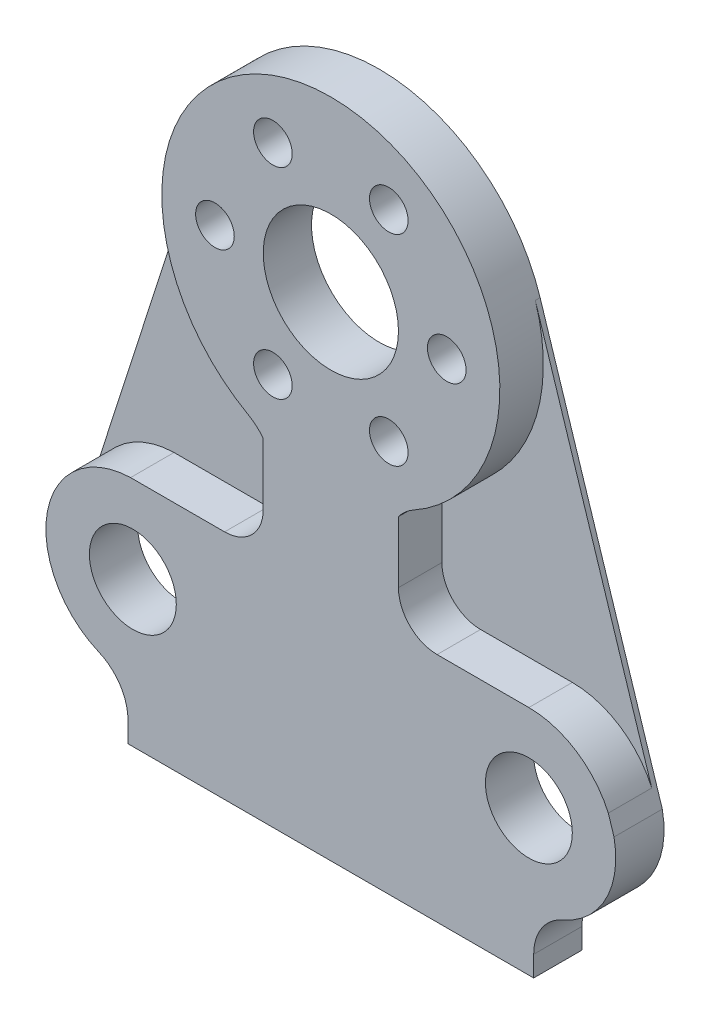
ISO-10303-21;
HEADER;
FILE_DESCRIPTION(('STEP AP214'),'2;1');
FILE_NAME('part.step','',(''),(''),'','','');
FILE_SCHEMA(('AUTOMOTIVE_DESIGN { 1 0 10303 214 1 1 1 1 }'));
ENDSEC;
DATA;
#1=APPLICATION_CONTEXT('core data for automotive mechanical design processes');
#2=APPLICATION_PROTOCOL_DEFINITION('international standard','automotive_design',2000,#1);
#3=PRODUCT_CONTEXT('',#1,'mechanical');
#4=PRODUCT('Part','Part','',(#3));
#5=PRODUCT_RELATED_PRODUCT_CATEGORY('part','',(#4));
#6=PRODUCT_DEFINITION_FORMATION('','',#4);
#7=PRODUCT_DEFINITION_CONTEXT('part definition',#1,'design');
#8=PRODUCT_DEFINITION('design','',#6,#7);
#9=PRODUCT_DEFINITION_SHAPE('','',#8);
#10=(LENGTH_UNIT() NAMED_UNIT(*) SI_UNIT(.MILLI.,.METRE.));
#11=(NAMED_UNIT(*) PLANE_ANGLE_UNIT() SI_UNIT($,.RADIAN.));
#12=(NAMED_UNIT(*) SI_UNIT($,.STERADIAN.) SOLID_ANGLE_UNIT());
#13=UNCERTAINTY_MEASURE_WITH_UNIT(LENGTH_MEASURE(1.E-05),#10,'distance_accuracy_value','');
#14=(GEOMETRIC_REPRESENTATION_CONTEXT(3) GLOBAL_UNCERTAINTY_ASSIGNED_CONTEXT((#13)) GLOBAL_UNIT_ASSIGNED_CONTEXT((#10,
#11,#12)) REPRESENTATION_CONTEXT('',''));
#15=CARTESIAN_POINT('',(0.,0.,0.));
#16=DIRECTION('',(0.,0.,1.));
#17=DIRECTION('',(1.,0.,0.));
#18=AXIS2_PLACEMENT_3D('',#15,#16,#17);
#19=CARTESIAN_POINT('',(0.,0.,10.));
#20=DIRECTION('',(0.,0.,-1.));
#21=DIRECTION('',(-1.,0.,0.));
#22=AXIS2_PLACEMENT_3D('',#19,#20,#21);
#23=CYLINDRICAL_SURFACE('',#22,35.);
#24=DIRECTION('',(0.,0.,-1.));
#25=VECTOR('',#24,1.);
#26=CARTESIAN_POINT('',(-33.3347186790443,10.667545668474,1.));
#27=LINE('',#26,#25);
#28=CARTESIAN_POINT('',(-33.3347186790443,10.667545668474,0.999999999999999));
#29=VERTEX_POINT('',#28);
#30=CARTESIAN_POINT('',(-33.3347186790431,10.6675456684777,0.));
#31=VERTEX_POINT('',#30);
#32=EDGE_CURVE('E50',#29,#31,#27,.T.);
#33=ORIENTED_EDGE('',*,*,#32,.F.);
#34=CARTESIAN_POINT('',(0.,0.,1.));
#35=DIRECTION('',(0.,0.,1.));
#36=DIRECTION('',(1.,0.,0.));
#37=AXIS2_PLACEMENT_3D('',#34,#35,#36);
#38=CIRCLE('',#37,35.);
#39=CARTESIAN_POINT('',(-17.1111111111111,-30.5321122188297,0.999999999999999));
#40=VERTEX_POINT('',#39);
#41=EDGE_CURVE('E55',#29,#40,#38,.T.);
#42=ORIENTED_EDGE('',*,*,#41,.T.);
#43=DIRECTION('',(0.,0.,-1.));
#44=VECTOR('',#43,1.);
#45=CARTESIAN_POINT('',(-17.1111111111111,-30.5321122188297,10.));
#46=LINE('',#45,#44);
#47=CARTESIAN_POINT('',(-17.1111111111111,-30.5321122188297,10.));
#48=VERTEX_POINT('',#47);
#49=EDGE_CURVE('E11',#48,#40,#46,.T.);
#50=ORIENTED_EDGE('',*,*,#49,.F.);
#51=CARTESIAN_POINT('',(0.,0.,10.));
#52=DIRECTION('',(0.,0.,1.));
#53=DIRECTION('',(1.,0.,0.));
#54=AXIS2_PLACEMENT_3D('',#51,#52,#53);
#55=CIRCLE('',#54,35.);
#56=CARTESIAN_POINT('',(17.1111111111111,-30.5321122188297,10.));
#57=VERTEX_POINT('',#56);
#58=EDGE_CURVE('E177',#57,#48,#55,.T.);
#59=ORIENTED_EDGE('',*,*,#58,.F.);
#60=DIRECTION('',(0.,0.,-1.));
#61=VECTOR('',#60,1.);
#62=CARTESIAN_POINT('',(17.1111111111111,-30.5321122188297,10.));
#63=LINE('',#62,#61);
#64=CARTESIAN_POINT('',(17.1111111111111,-30.5321122188297,0.999999999999999));
#65=VERTEX_POINT('',#64);
#66=EDGE_CURVE('E241',#57,#65,#63,.T.);
#67=ORIENTED_EDGE('',*,*,#66,.T.);
#68=CARTESIAN_POINT('',(0.,0.,1.));
#69=DIRECTION('',(0.,0.,1.));
#70=DIRECTION('',(1.,0.,0.));
#71=AXIS2_PLACEMENT_3D('',#68,#69,#70);
#72=CIRCLE('',#71,35.);
#73=CARTESIAN_POINT('',(33.3347186790443,10.6675456684739,0.999999999999999));
#74=VERTEX_POINT('',#73);
#75=EDGE_CURVE('E377',#65,#74,#72,.T.);
#76=ORIENTED_EDGE('',*,*,#75,.T.);
#77=DIRECTION('',(0.,0.,-1.));
#78=VECTOR('',#77,1.);
#79=CARTESIAN_POINT('',(33.3347186790443,10.667545668474,1.));
#80=LINE('',#79,#78);
#81=CARTESIAN_POINT('',(33.3347186790443,10.667545668474,0.));
#82=VERTEX_POINT('',#81);
#83=EDGE_CURVE('E246',#74,#82,#80,.T.);
#84=ORIENTED_EDGE('',*,*,#83,.T.);
#85=CARTESIAN_POINT('',(0.,0.,0.));
#86=DIRECTION('',(0.,0.,1.));
#87=DIRECTION('',(1.,0.,0.));
#88=AXIS2_PLACEMENT_3D('',#85,#86,#87);
#89=CIRCLE('',#88,35.);
#90=EDGE_CURVE('E264',#82,#31,#89,.T.);
#91=ORIENTED_EDGE('',*,*,#90,.T.);
#92=EDGE_LOOP('',(#33,#42,#50,#59,#67,#76,#84,#91));
#93=FACE_BOUND('',#92,.T.);
#94=ADVANCED_FACE('F35',(#93),#23,.T.);
#95=CARTESIAN_POINT('',(-22.,-39.2555728527811,10.));
#96=DIRECTION('',(0.,0.,-1.));
#97=DIRECTION('',(-1.,0.,0.));
#98=AXIS2_PLACEMENT_3D('',#95,#96,#97);
#99=CYLINDRICAL_SURFACE('',#98,10.);
#100=CARTESIAN_POINT('',(-22.,-39.2555728527811,1.));
#101=DIRECTION('',(0.,0.,1.));
#102=DIRECTION('',(1.,0.,0.));
#103=AXIS2_PLACEMENT_3D('',#100,#101,#102);
#104=CIRCLE('',#103,10.);
#105=CARTESIAN_POINT('',(-14.,-33.255572852781,0.999999999999999));
#106=VERTEX_POINT('',#105);
#107=EDGE_CURVE('E342',#106,#40,#104,.T.);
#108=ORIENTED_EDGE('',*,*,#107,.F.);
#109=DIRECTION('',(0.,0.,-1.));
#110=VECTOR('',#109,1.);
#111=CARTESIAN_POINT('',(-14.,-33.255572852781,10.));
#112=LINE('',#111,#110);
#113=CARTESIAN_POINT('',(-14.,-33.255572852781,10.));
#114=VERTEX_POINT('',#113);
#115=EDGE_CURVE('E43',#114,#106,#112,.T.);
#116=ORIENTED_EDGE('',*,*,#115,.F.);
#117=CARTESIAN_POINT('',(-22.,-39.2555728527811,10.));
#118=DIRECTION('',(0.,0.,1.));
#119=DIRECTION('',(1.,0.,0.));
#120=AXIS2_PLACEMENT_3D('',#117,#118,#119);
#121=CIRCLE('',#120,10.);
#122=EDGE_CURVE('E181',#114,#48,#121,.T.);
#123=ORIENTED_EDGE('',*,*,#122,.T.);
#124=ORIENTED_EDGE('',*,*,#49,.T.);
#125=EDGE_LOOP('',(#108,#116,#123,#124));
#126=FACE_BOUND('',#125,.T.);
#127=ADVANCED_FACE('F191',(#126),#99,.F.);
#128=CARTESIAN_POINT('',(-14.,0.,10.));
#129=DIRECTION('',(1.,0.,0.));
#130=DIRECTION('',(0.,1.,0.));
#131=AXIS2_PLACEMENT_3D('',#128,#129,#130);
#132=PLANE('',#131);
#133=ORIENTED_EDGE('',*,*,#115,.T.);
#134=DIRECTION('',(0.,-1.,0.));
#135=VECTOR('',#134,1.);
#136=CARTESIAN_POINT('',(-14.,0.,1.));
#137=LINE('',#136,#135);
#138=CARTESIAN_POINT('',(-14.,-46.,0.999999999999999));
#139=VERTEX_POINT('',#138);
#140=EDGE_CURVE('E338',#106,#139,#137,.T.);
#141=ORIENTED_EDGE('',*,*,#140,.T.);
#142=DIRECTION('',(0.,0.,-1.));
#143=VECTOR('',#142,1.);
#144=CARTESIAN_POINT('',(-14.,-46.,10.));
#145=LINE('',#144,#143);
#146=CARTESIAN_POINT('',(-14.,-46.,10.));
#147=VERTEX_POINT('',#146);
#148=EDGE_CURVE('E332',#147,#139,#145,.T.);
#149=ORIENTED_EDGE('',*,*,#148,.F.);
#150=DIRECTION('',(0.,-1.,0.));
#151=VECTOR('',#150,1.);
#152=CARTESIAN_POINT('',(-14.,0.,10.));
#153=LINE('',#152,#151);
#154=EDGE_CURVE('E194',#114,#147,#153,.T.);
#155=ORIENTED_EDGE('',*,*,#154,.F.);
#156=EDGE_LOOP('',(#133,#141,#149,#155));
#157=FACE_BOUND('',#156,.T.);
#158=ADVANCED_FACE('F336',(#157),#132,.F.);
#159=CARTESIAN_POINT('',(-22.,-46.,10.));
#160=DIRECTION('',(0.,0.,-1.));
#161=DIRECTION('',(-1.,0.,0.));
#162=AXIS2_PLACEMENT_3D('',#159,#160,#161);
#163=CYLINDRICAL_SURFACE('',#162,7.9999999999991);
#164=ORIENTED_EDGE('',*,*,#148,.T.);
#165=CARTESIAN_POINT('',(-22.,-46.,1.));
#166=DIRECTION('',(0.,0.,1.));
#167=DIRECTION('',(1.,0.,0.));
#168=AXIS2_PLACEMENT_3D('',#165,#166,#167);
#169=CIRCLE('',#168,7.9999999999991);
#170=CARTESIAN_POINT('',(-21.9999999999984,-53.9999999999982,0.999999999999999));
#171=VERTEX_POINT('',#170);
#172=EDGE_CURVE('E344',#139,#171,#169,.F.);
#173=ORIENTED_EDGE('',*,*,#172,.T.);
#174=DIRECTION('',(0.,0.,-1.));
#175=VECTOR('',#174,1.);
#176=CARTESIAN_POINT('',(-21.9999999999984,-53.9999999999982,10.));
#177=LINE('',#176,#175);
#178=CARTESIAN_POINT('',(-21.9999999999984,-53.9999999999982,10.));
#179=VERTEX_POINT('',#178);
#180=EDGE_CURVE('E329',#179,#171,#177,.T.);
#181=ORIENTED_EDGE('',*,*,#180,.F.);
#182=CARTESIAN_POINT('',(-22.,-46.,10.));
#183=DIRECTION('',(0.,0.,1.));
#184=DIRECTION('',(1.,0.,0.));
#185=AXIS2_PLACEMENT_3D('',#182,#183,#184);
#186=CIRCLE('',#185,7.9999999999991);
#187=EDGE_CURVE('E196',#147,#179,#186,.F.);
#188=ORIENTED_EDGE('',*,*,#187,.F.);
#189=EDGE_LOOP('',(#164,#173,#181,#188));
#190=FACE_BOUND('',#189,.T.);
#191=ADVANCED_FACE('F533',(#190),#163,.F.);
#192=CARTESIAN_POINT('',(-1.57815031569447E-12,-53.9999999999988,10.));
#193=DIRECTION('',(0.,1.,0.));
#194=DIRECTION('',(-1.,0.,0.));
#195=AXIS2_PLACEMENT_3D('',#192,#193,#194);
#196=PLANE('',#195);
#197=DIRECTION('',(1.,0.,0.));
#198=VECTOR('',#197,1.);
#199=CARTESIAN_POINT('',(-1.57815031569447E-12,-53.9999999999988,1.));
#200=LINE('',#199,#198);
#201=CARTESIAN_POINT('',(-41.4692621488196,-53.9999999999976,0.999999999999999));
#202=VERTEX_POINT('',#201);
#203=EDGE_CURVE('E357',#202,#171,#200,.T.);
#204=ORIENTED_EDGE('',*,*,#203,.F.);
#205=DIRECTION('',(0.,0.,-1.));
#206=VECTOR('',#205,1.);
#207=CARTESIAN_POINT('',(-41.4692621488196,-53.9999999999976,10.));
#208=LINE('',#207,#206);
#209=CARTESIAN_POINT('',(-41.4692621488196,-53.9999999999976,10.));
#210=VERTEX_POINT('',#209);
#211=EDGE_CURVE('E326',#210,#202,#208,.T.);
#212=ORIENTED_EDGE('',*,*,#211,.F.);
#213=DIRECTION('',(1.,0.,0.));
#214=VECTOR('',#213,1.);
#215=CARTESIAN_POINT('',(-1.57815031569447E-12,-53.9999999999988,10.));
#216=LINE('',#215,#214);
#217=EDGE_CURVE('E201',#210,#179,#216,.T.);
#218=ORIENTED_EDGE('',*,*,#217,.T.);
#219=ORIENTED_EDGE('',*,*,#180,.T.);
#220=EDGE_LOOP('',(#204,#212,#218,#219));
#221=FACE_BOUND('',#220,.T.);
#222=ADVANCED_FACE('F529',(#221),#196,.T.);
#223=CARTESIAN_POINT('',(-41.,-72.,10.));
#224=DIRECTION('',(0.,0.,-1.));
#225=DIRECTION('',(-1.,0.,0.));
#226=AXIS2_PLACEMENT_3D('',#223,#224,#225);
#227=CYLINDRICAL_SURFACE('',#226,18.0061158211426);
#228=CARTESIAN_POINT('',(-41.,-72.,1.));
#229=DIRECTION('',(0.,0.,1.));
#230=DIRECTION('',(1.,0.,0.));
#231=AXIS2_PLACEMENT_3D('',#228,#229,#230);
#232=CIRCLE('',#231,18.0061158211426);
#233=CARTESIAN_POINT('',(-58.141884057955,-66.4885557330198,0.999999999999999));
#234=VERTEX_POINT('',#233);
#235=EDGE_CURVE('E355',#202,#234,#232,.T.);
#236=ORIENTED_EDGE('',*,*,#235,.T.);
#237=DIRECTION('',(0.,0.,-1.));
#238=VECTOR('',#237,1.);
#239=CARTESIAN_POINT('',(-58.141884057955,-66.4885557330198,1.));
#240=LINE('',#239,#238);
#241=CARTESIAN_POINT('',(-58.141884057955,-66.4885557330198,0.));
#242=VERTEX_POINT('',#241);
#243=EDGE_CURVE('E359',#234,#242,#240,.T.);
#244=ORIENTED_EDGE('',*,*,#243,.T.);
#245=CARTESIAN_POINT('',(-41.,-72.,0.));
#246=DIRECTION('',(0.,0.,1.));
#247=DIRECTION('',(1.,0.,0.));
#248=AXIS2_PLACEMENT_3D('',#245,#246,#247);
#249=CIRCLE('',#248,18.0061158211426);
#250=CARTESIAN_POINT('',(-48.0722864711944,-88.5590751865484,0.));
#251=VERTEX_POINT('',#250);
#252=EDGE_CURVE('E266',#242,#251,#249,.T.);
#253=ORIENTED_EDGE('',*,*,#252,.T.);
#254=DIRECTION('',(0.,0.,-1.));
#255=VECTOR('',#254,1.);
#256=CARTESIAN_POINT('',(-48.0722864711944,-88.5590751865484,10.));
#257=LINE('',#256,#255);
#258=CARTESIAN_POINT('',(-48.0722864711944,-88.5590751865484,10.));
#259=VERTEX_POINT('',#258);
#260=EDGE_CURVE('E323',#259,#251,#257,.T.);
#261=ORIENTED_EDGE('',*,*,#260,.F.);
#262=CARTESIAN_POINT('',(-41.,-72.,10.));
#263=DIRECTION('',(0.,0.,1.));
#264=DIRECTION('',(1.,0.,0.));
#265=AXIS2_PLACEMENT_3D('',#262,#263,#264);
#266=CIRCLE('',#265,18.0061158211426);
#267=EDGE_CURVE('E204',#210,#259,#266,.T.);
#268=ORIENTED_EDGE('',*,*,#267,.F.);
#269=ORIENTED_EDGE('',*,*,#211,.T.);
#270=EDGE_LOOP('',(#236,#244,#253,#261,#268,#269));
#271=FACE_BOUND('',#270,.T.);
#272=ADVANCED_FACE('F525',(#271),#227,.T.);
#273=CARTESIAN_POINT('',(-52.,-97.7554367733711,10.));
#274=DIRECTION('',(0.,0.,-1.));
#275=DIRECTION('',(-1.,0.,0.));
#276=AXIS2_PLACEMENT_3D('',#273,#274,#275);
#277=CYLINDRICAL_SURFACE('',#276,9.9999999999988);
#278=CARTESIAN_POINT('',(-52.,-97.7554367733711,0.));
#279=DIRECTION('',(0.,0.,1.));
#280=DIRECTION('',(1.,0.,0.));
#281=AXIS2_PLACEMENT_3D('',#278,#279,#280);
#282=CIRCLE('',#281,9.9999999999988);
#283=CARTESIAN_POINT('',(-42.,-97.7554367733737,0.));
#284=VERTEX_POINT('',#283);
#285=EDGE_CURVE('E268',#284,#251,#282,.T.);
#286=ORIENTED_EDGE('',*,*,#285,.F.);
#287=DIRECTION('',(0.,0.,-1.));
#288=VECTOR('',#287,1.);
#289=CARTESIAN_POINT('',(-42.,-97.7554367733737,10.));
#290=LINE('',#289,#288);
#291=CARTESIAN_POINT('',(-42.,-97.7554367733737,10.));
#292=VERTEX_POINT('',#291);
#293=EDGE_CURVE('E321',#292,#284,#290,.T.);
#294=ORIENTED_EDGE('',*,*,#293,.F.);
#295=CARTESIAN_POINT('',(-52.,-97.7554367733711,10.));
#296=DIRECTION('',(0.,0.,1.));
#297=DIRECTION('',(1.,0.,0.));
#298=AXIS2_PLACEMENT_3D('',#295,#296,#297);
#299=CIRCLE('',#298,9.9999999999988);
#300=EDGE_CURVE('E206',#292,#259,#299,.T.);
#301=ORIENTED_EDGE('',*,*,#300,.T.);
#302=ORIENTED_EDGE('',*,*,#260,.T.);
#303=EDGE_LOOP('',(#286,#294,#301,#302));
#304=FACE_BOUND('',#303,.T.);
#305=ADVANCED_FACE('F521',(#304),#277,.F.);
#306=CARTESIAN_POINT('',(-41.9999999999998,0.,10.));
#307=DIRECTION('',(1.,0.,0.));
#308=DIRECTION('',(0.,1.,0.));
#309=AXIS2_PLACEMENT_3D('',#306,#307,#308);
#310=PLANE('',#309);
#311=DIRECTION('',(0.,-1.,0.));
#312=VECTOR('',#311,1.);
#313=CARTESIAN_POINT('',(-41.9999999999998,0.,0.));
#314=LINE('',#313,#312);
#315=CARTESIAN_POINT('',(-42.,-102.,0.));
#316=VERTEX_POINT('',#315);
#317=EDGE_CURVE('E271',#284,#316,#314,.T.);
#318=ORIENTED_EDGE('',*,*,#317,.T.);
#319=DIRECTION('',(0.,0.,-1.));
#320=VECTOR('',#319,1.);
#321=CARTESIAN_POINT('',(-42.,-102.,10.));
#322=LINE('',#321,#320);
#323=CARTESIAN_POINT('',(-42.,-102.,10.));
#324=VERTEX_POINT('',#323);
#325=EDGE_CURVE('E318',#324,#316,#322,.T.);
#326=ORIENTED_EDGE('',*,*,#325,.F.);
#327=DIRECTION('',(0.,-1.,0.));
#328=VECTOR('',#327,1.);
#329=CARTESIAN_POINT('',(-41.9999999999998,0.,10.));
#330=LINE('',#329,#328);
#331=EDGE_CURVE('E209',#292,#324,#330,.T.);
#332=ORIENTED_EDGE('',*,*,#331,.F.);
#333=ORIENTED_EDGE('',*,*,#293,.T.);
#334=EDGE_LOOP('',(#318,#326,#332,#333));
#335=FACE_BOUND('',#334,.T.);
#336=ADVANCED_FACE('F517',(#335),#310,.F.);
#337=CARTESIAN_POINT('',(0.,-102.,10.));
#338=DIRECTION('',(0.,1.,0.));
#339=DIRECTION('',(0.,0.,1.));
#340=AXIS2_PLACEMENT_3D('',#337,#338,#339);
#341=PLANE('',#340);
#342=DIRECTION('',(1.,0.,0.));
#343=VECTOR('',#342,1.);
#344=CARTESIAN_POINT('',(0.,-102.,0.));
#345=LINE('',#344,#343);
#346=CARTESIAN_POINT('',(42.,-102.,0.));
#347=VERTEX_POINT('',#346);
#348=EDGE_CURVE('E273',#316,#347,#345,.T.);
#349=ORIENTED_EDGE('',*,*,#348,.T.);
#350=DIRECTION('',(0.,0.,-1.));
#351=VECTOR('',#350,1.);
#352=CARTESIAN_POINT('',(42.,-102.,10.));
#353=LINE('',#352,#351);
#354=CARTESIAN_POINT('',(42.,-102.,10.));
#355=VERTEX_POINT('',#354);
#356=EDGE_CURVE('E316',#355,#347,#353,.T.);
#357=ORIENTED_EDGE('',*,*,#356,.F.);
#358=DIRECTION('',(1.,0.,0.));
#359=VECTOR('',#358,1.);
#360=CARTESIAN_POINT('',(0.,-102.,10.));
#361=LINE('',#360,#359);
#362=EDGE_CURVE('E211',#324,#355,#361,.T.);
#363=ORIENTED_EDGE('',*,*,#362,.F.);
#364=ORIENTED_EDGE('',*,*,#325,.T.);
#365=EDGE_LOOP('',(#349,#357,#363,#364));
#366=FACE_BOUND('',#365,.T.);
#367=ADVANCED_FACE('F513',(#366),#341,.F.);
#368=CARTESIAN_POINT('',(42.,0.,10.));
#369=DIRECTION('',(1.,0.,0.));
#370=DIRECTION('',(0.,0.,-1.));
#371=AXIS2_PLACEMENT_3D('',#368,#369,#370);
#372=PLANE('',#371);
#373=DIRECTION('',(0.,-1.,0.));
#374=VECTOR('',#373,1.);
#375=CARTESIAN_POINT('',(42.,0.,0.));
#376=LINE('',#375,#374);
#377=CARTESIAN_POINT('',(42.,-97.7487863791674,0.));
#378=VERTEX_POINT('',#377);
#379=EDGE_CURVE('E276',#378,#347,#376,.T.);
#380=ORIENTED_EDGE('',*,*,#379,.F.);
#381=DIRECTION('',(0.,0.,-1.));
#382=VECTOR('',#381,1.);
#383=CARTESIAN_POINT('',(42.,-97.7487863791674,10.));
#384=LINE('',#383,#382);
#385=CARTESIAN_POINT('',(42.,-97.7487863791674,10.));
#386=VERTEX_POINT('',#385);
#387=EDGE_CURVE('E314',#386,#378,#384,.T.);
#388=ORIENTED_EDGE('',*,*,#387,.F.);
#389=DIRECTION('',(0.,-1.,0.));
#390=VECTOR('',#389,1.);
#391=CARTESIAN_POINT('',(42.,0.,10.));
#392=LINE('',#391,#390);
#393=EDGE_CURVE('E213',#386,#355,#392,.T.);
#394=ORIENTED_EDGE('',*,*,#393,.T.);
#395=ORIENTED_EDGE('',*,*,#356,.T.);
#396=EDGE_LOOP('',(#380,#388,#394,#395));
#397=FACE_BOUND('',#396,.T.);
#398=ADVANCED_FACE('F509',(#397),#372,.T.);
#399=CARTESIAN_POINT('',(52.,-97.7487863791675,10.));
#400=DIRECTION('',(0.,0.,-1.));
#401=DIRECTION('',(-1.,0.,0.));
#402=AXIS2_PLACEMENT_3D('',#399,#400,#401);
#403=CYLINDRICAL_SURFACE('',#402,10.);
#404=CARTESIAN_POINT('',(52.,-97.7487863791675,0.));
#405=DIRECTION('',(0.,0.,1.));
#406=DIRECTION('',(1.,0.,0.));
#407=AXIS2_PLACEMENT_3D('',#404,#405,#406);
#408=CIRCLE('',#407,10.);
#409=CARTESIAN_POINT('',(48.0714285714286,-88.5527912437505,0.));
#410=VERTEX_POINT('',#409);
#411=EDGE_CURVE('E279',#410,#378,#408,.T.);
#412=ORIENTED_EDGE('',*,*,#411,.F.);
#413=DIRECTION('',(0.,0.,-1.));
#414=VECTOR('',#413,1.);
#415=CARTESIAN_POINT('',(48.0714285714286,-88.5527912437505,10.));
#416=LINE('',#415,#414);
#417=CARTESIAN_POINT('',(48.0714285714286,-88.5527912437505,10.));
#418=VERTEX_POINT('',#417);
#419=EDGE_CURVE('E312',#418,#410,#416,.T.);
#420=ORIENTED_EDGE('',*,*,#419,.F.);
#421=CARTESIAN_POINT('',(52.,-97.7487863791675,10.));
#422=DIRECTION('',(0.,0.,1.));
#423=DIRECTION('',(1.,0.,0.));
#424=AXIS2_PLACEMENT_3D('',#421,#422,#423);
#425=CIRCLE('',#424,10.);
#426=EDGE_CURVE('E216',#418,#386,#425,.T.);
#427=ORIENTED_EDGE('',*,*,#426,.T.);
#428=ORIENTED_EDGE('',*,*,#387,.T.);
#429=EDGE_LOOP('',(#412,#420,#427,#428));
#430=FACE_BOUND('',#429,.T.);
#431=ADVANCED_FACE('F506',(#430),#403,.F.);
#432=CARTESIAN_POINT('',(41.,-72.,10.));
#433=DIRECTION('',(0.,0.,-1.));
#434=DIRECTION('',(-1.,0.,0.));
#435=AXIS2_PLACEMENT_3D('',#432,#433,#434);
#436=CYLINDRICAL_SURFACE('',#435,18.);
#437=CARTESIAN_POINT('',(41.,-72.,0.));
#438=DIRECTION('',(0.,0.,1.));
#439=DIRECTION('',(1.,0.,0.));
#440=AXIS2_PLACEMENT_3D('',#437,#438,#439);
#441=CIRCLE('',#440,18.);
#442=CARTESIAN_POINT('',(58.6344867006033,-68.3910003039286,0.));
#443=VERTEX_POINT('',#442);
#444=EDGE_CURVE('E282',#410,#443,#441,.T.);
#445=ORIENTED_EDGE('',*,*,#444,.T.);
#446=DIRECTION('',(0.,0.,-1.));
#447=VECTOR('',#446,1.);
#448=CARTESIAN_POINT('',(58.6344867006033,-68.3910003039286,10.));
#449=LINE('',#448,#447);
#450=CARTESIAN_POINT('',(58.6344867006033,-68.3910003039286,10.));
#451=VERTEX_POINT('',#450);
#452=EDGE_CURVE('E310',#451,#443,#449,.T.);
#453=ORIENTED_EDGE('',*,*,#452,.F.);
#454=CARTESIAN_POINT('',(41.,-72.,10.));
#455=DIRECTION('',(0.,0.,1.));
#456=DIRECTION('',(1.,0.,0.));
#457=AXIS2_PLACEMENT_3D('',#454,#455,#456);
#458=CIRCLE('',#457,18.);
#459=EDGE_CURVE('E219',#418,#451,#458,.T.);
#460=ORIENTED_EDGE('',*,*,#459,.F.);
#461=ORIENTED_EDGE('',*,*,#419,.T.);
#462=EDGE_LOOP('',(#445,#453,#460,#461));
#463=FACE_BOUND('',#462,.T.);
#464=ADVANCED_FACE('F502',(#463),#436,.T.);
#465=CARTESIAN_POINT('',(33.3347186790443,10.6675456684739,10.));
#466=DIRECTION('',(0.952420533686979,0.304787019099255,0.));
#467=DIRECTION('',(-0.304787019099255,0.952420533686979,0.));
#468=AXIS2_PLACEMENT_3D('',#465,#466,#467);
#469=PLANE('',#468);
#470=DIRECTION('',(0.304787019099255,-0.952420533686979,0.));
#471=VECTOR('',#470,1.);
#472=CARTESIAN_POINT('',(33.3347186790443,10.6675456684739,0.));
#473=LINE('',#472,#471);
#474=EDGE_CURVE('E285',#82,#443,#473,.T.);
#475=ORIENTED_EDGE('',*,*,#474,.F.);
#476=ORIENTED_EDGE('',*,*,#83,.F.);
#477=DIRECTION('',(0.304787019099255,-0.952420533686979,0.));
#478=VECTOR('',#477,1.);
#479=CARTESIAN_POINT('',(33.3347186790443,10.6675456684739,1.));
#480=LINE('',#479,#478);
#481=CARTESIAN_POINT('',(57.4534508887791,-64.7004141315733,0.999999999999999));
#482=VERTEX_POINT('',#481);
#483=EDGE_CURVE('E374',#74,#482,#480,.T.);
#484=ORIENTED_EDGE('',*,*,#483,.T.);
#485=DIRECTION('',(0.,0.,-1.));
#486=VECTOR('',#485,1.);
#487=CARTESIAN_POINT('',(57.4534508887791,-64.7004141315733,10.));
#488=LINE('',#487,#486);
#489=CARTESIAN_POINT('',(57.4534508887791,-64.7004141315733,10.));
#490=VERTEX_POINT('',#489);
#491=EDGE_CURVE('E308',#490,#482,#488,.T.);
#492=ORIENTED_EDGE('',*,*,#491,.F.);
#493=DIRECTION('',(0.304787019099255,-0.952420533686979,0.));
#494=VECTOR('',#493,1.);
#495=CARTESIAN_POINT('',(33.3347186790443,10.6675456684739,10.));
#496=LINE('',#495,#494);
#497=EDGE_CURVE('E221',#490,#451,#496,.T.);
#498=ORIENTED_EDGE('',*,*,#497,.T.);
#499=ORIENTED_EDGE('',*,*,#452,.T.);
#500=EDGE_LOOP('',(#475,#476,#484,#492,#498,#499));
#501=FACE_BOUND('',#500,.T.);
#502=ADVANCED_FACE('F500',(#501),#469,.T.);
#503=ORIENTED_EDGE('',*,*,#491,.T.);
#504=CARTESIAN_POINT('',(41.,-72.,1.));
#505=DIRECTION('',(0.,0.,1.));
#506=DIRECTION('',(1.,0.,0.));
#507=AXIS2_PLACEMENT_3D('',#504,#505,#506);
#508=CIRCLE('',#507,18.);
#509=CARTESIAN_POINT('',(41.,-54.,0.999999999999999));
#510=VERTEX_POINT('',#509);
#511=EDGE_CURVE('E372',#482,#510,#508,.T.);
#512=ORIENTED_EDGE('',*,*,#511,.T.);
#513=DIRECTION('',(0.,0.,-1.));
#514=VECTOR('',#513,1.);
#515=CARTESIAN_POINT('',(41.,-54.,10.));
#516=LINE('',#515,#514);
#517=CARTESIAN_POINT('',(41.,-54.,10.));
#518=VERTEX_POINT('',#517);
#519=EDGE_CURVE('E305',#518,#510,#516,.T.);
#520=ORIENTED_EDGE('',*,*,#519,.F.);
#521=EDGE_CURVE('E222',#490,#518,#458,.T.);
#522=ORIENTED_EDGE('',*,*,#521,.F.);
#523=EDGE_LOOP('',(#503,#512,#520,#522));
#524=FACE_BOUND('',#523,.T.);
#525=ADVANCED_FACE('F496',(#524),#436,.T.);
#526=CARTESIAN_POINT('',(-1.57264273726316E-12,-53.9999999999988,10.));
#527=DIRECTION('',(0.,1.,0.));
#528=DIRECTION('',(-1.,0.,0.));
#529=AXIS2_PLACEMENT_3D('',#526,#527,#528);
#530=PLANE('',#529);
#531=DIRECTION('',(1.,0.,0.));
#532=VECTOR('',#531,1.);
#533=CARTESIAN_POINT('',(-1.57264273726316E-12,-53.9999999999988,1.));
#534=LINE('',#533,#532);
#535=CARTESIAN_POINT('',(21.9999999999998,-53.9999999999994,0.999999999999999));
#536=VERTEX_POINT('',#535);
#537=EDGE_CURVE('E369',#536,#510,#534,.T.);
#538=ORIENTED_EDGE('',*,*,#537,.F.);
#539=DIRECTION('',(0.,0.,-1.));
#540=VECTOR('',#539,1.);
#541=CARTESIAN_POINT('',(21.9999999999998,-53.9999999999994,10.));
#542=LINE('',#541,#540);
#543=CARTESIAN_POINT('',(21.9999999999998,-53.9999999999994,10.));
#544=VERTEX_POINT('',#543);
#545=EDGE_CURVE('E302',#544,#536,#542,.T.);
#546=ORIENTED_EDGE('',*,*,#545,.F.);
#547=DIRECTION('',(1.,0.,0.));
#548=VECTOR('',#547,1.);
#549=CARTESIAN_POINT('',(-1.57264273726316E-12,-53.9999999999988,10.));
#550=LINE('',#549,#548);
#551=EDGE_CURVE('E225',#544,#518,#550,.T.);
#552=ORIENTED_EDGE('',*,*,#551,.T.);
#553=ORIENTED_EDGE('',*,*,#519,.T.);
#554=EDGE_LOOP('',(#538,#546,#552,#553));
#555=FACE_BOUND('',#554,.T.);
#556=ADVANCED_FACE('F492',(#555),#530,.T.);
#557=CARTESIAN_POINT('',(22.,-46.,10.));
#558=DIRECTION('',(0.,0.,-1.));
#559=DIRECTION('',(-1.,0.,0.));
#560=AXIS2_PLACEMENT_3D('',#557,#558,#559);
#561=CYLINDRICAL_SURFACE('',#560,7.9999999999991);
#562=CARTESIAN_POINT('',(22.,-46.,1.));
#563=DIRECTION('',(0.,0.,1.));
#564=DIRECTION('',(1.,0.,0.));
#565=AXIS2_PLACEMENT_3D('',#562,#563,#564);
#566=CIRCLE('',#565,7.9999999999991);
#567=CARTESIAN_POINT('',(14.,-46.,0.999999999999999));
#568=VERTEX_POINT('',#567);
#569=EDGE_CURVE('E366',#568,#536,#566,.T.);
#570=ORIENTED_EDGE('',*,*,#569,.F.);
#571=DIRECTION('',(0.,0.,-1.));
#572=VECTOR('',#571,1.);
#573=CARTESIAN_POINT('',(14.,-46.,10.));
#574=LINE('',#573,#572);
#575=CARTESIAN_POINT('',(14.,-46.,10.));
#576=VERTEX_POINT('',#575);
#577=EDGE_CURVE('E299',#576,#568,#574,.T.);
#578=ORIENTED_EDGE('',*,*,#577,.F.);
#579=CARTESIAN_POINT('',(22.,-46.,10.));
#580=DIRECTION('',(0.,0.,1.));
#581=DIRECTION('',(1.,0.,0.));
#582=AXIS2_PLACEMENT_3D('',#579,#580,#581);
#583=CIRCLE('',#582,7.9999999999991);
#584=EDGE_CURVE('E228',#576,#544,#583,.T.);
#585=ORIENTED_EDGE('',*,*,#584,.T.);
#586=ORIENTED_EDGE('',*,*,#545,.T.);
#587=EDGE_LOOP('',(#570,#578,#585,#586));
#588=FACE_BOUND('',#587,.T.);
#589=ADVANCED_FACE('F486',(#588),#561,.F.);
#590=CARTESIAN_POINT('',(14.,0.,10.));
#591=DIRECTION('',(1.,0.,0.));
#592=DIRECTION('',(0.,1.,0.));
#593=AXIS2_PLACEMENT_3D('',#590,#591,#592);
#594=PLANE('',#593);
#595=DIRECTION('',(0.,-1.,0.));
#596=VECTOR('',#595,1.);
#597=CARTESIAN_POINT('',(14.,0.,1.));
#598=LINE('',#597,#596);
#599=CARTESIAN_POINT('',(14.,-33.255572852781,0.999999999999999));
#600=VERTEX_POINT('',#599);
#601=EDGE_CURVE('E363',#600,#568,#598,.T.);
#602=ORIENTED_EDGE('',*,*,#601,.F.);
#603=DIRECTION('',(0.,0.,-1.));
#604=VECTOR('',#603,1.);
#605=CARTESIAN_POINT('',(14.,-33.255572852781,10.));
#606=LINE('',#605,#604);
#607=CARTESIAN_POINT('',(14.,-33.255572852781,10.));
#608=VERTEX_POINT('',#607);
#609=EDGE_CURVE('E296',#608,#600,#606,.T.);
#610=ORIENTED_EDGE('',*,*,#609,.F.);
#611=DIRECTION('',(0.,-1.,0.));
#612=VECTOR('',#611,1.);
#613=CARTESIAN_POINT('',(14.,0.,10.));
#614=LINE('',#613,#612);
#615=EDGE_CURVE('E231',#608,#576,#614,.T.);
#616=ORIENTED_EDGE('',*,*,#615,.T.);
#617=ORIENTED_EDGE('',*,*,#577,.T.);
#618=EDGE_LOOP('',(#602,#610,#616,#617));
#619=FACE_BOUND('',#618,.T.);
#620=ADVANCED_FACE('F477',(#619),#594,.T.);
#621=CARTESIAN_POINT('',(41.,-72.,10.));
#622=DIRECTION('',(0.,0.,-1.));
#623=DIRECTION('',(-1.,0.,0.));
#624=AXIS2_PLACEMENT_3D('',#621,#622,#623);
#625=CYLINDRICAL_SURFACE('',#624,9.00000000000001);
#626=CARTESIAN_POINT('',(41.,-72.,10.));
#627=DIRECTION('',(0.,0.,1.));
#628=DIRECTION('',(1.,0.,0.));
#629=AXIS2_PLACEMENT_3D('',#626,#627,#628);
#630=CIRCLE('',#629,9.00000000000001);
#631=CARTESIAN_POINT('',(50.,-72.,10.));
#632=VERTEX_POINT('',#631);
#633=EDGE_CURVE('E235',#632,#632,#630,.T.);
#634=ORIENTED_EDGE('',*,*,#633,.T.);
#635=EDGE_LOOP('',(#634));
#636=FACE_BOUND('',#635,.T.);
#637=CARTESIAN_POINT('',(41.,-72.,0.));
#638=DIRECTION('',(0.,0.,1.));
#639=DIRECTION('',(1.,0.,0.));
#640=AXIS2_PLACEMENT_3D('',#637,#638,#639);
#641=CIRCLE('',#640,9.00000000000001);
#642=CARTESIAN_POINT('',(50.,-72.,0.));
#643=VERTEX_POINT('',#642);
#644=EDGE_CURVE('E288',#643,#643,#641,.T.);
#645=ORIENTED_EDGE('',*,*,#644,.F.);
#646=EDGE_LOOP('',(#645));
#647=FACE_BOUND('',#646,.T.);
#648=ADVANCED_FACE('F475',(#636,#647),#625,.F.);
#649=CARTESIAN_POINT('',(22.,-39.2555728527811,10.));
#650=DIRECTION('',(0.,0.,-1.));
#651=DIRECTION('',(-1.,0.,0.));
#652=AXIS2_PLACEMENT_3D('',#649,#650,#651);
#653=CYLINDRICAL_SURFACE('',#652,10.);
#654=ORIENTED_EDGE('',*,*,#609,.T.);
#655=CARTESIAN_POINT('',(22.,-39.2555728527811,1.));
#656=DIRECTION('',(0.,0.,1.));
#657=DIRECTION('',(1.,0.,0.));
#658=AXIS2_PLACEMENT_3D('',#655,#656,#657);
#659=CIRCLE('',#658,10.);
#660=EDGE_CURVE('E379',#600,#65,#659,.F.);
#661=ORIENTED_EDGE('',*,*,#660,.T.);
#662=ORIENTED_EDGE('',*,*,#66,.F.);
#663=CARTESIAN_POINT('',(22.,-39.2555728527811,10.));
#664=DIRECTION('',(0.,0.,1.));
#665=DIRECTION('',(1.,0.,0.));
#666=AXIS2_PLACEMENT_3D('',#663,#664,#665);
#667=CIRCLE('',#666,10.);
#668=EDGE_CURVE('E184',#608,#57,#667,.F.);
#669=ORIENTED_EDGE('',*,*,#668,.F.);
#670=EDGE_LOOP('',(#654,#661,#662,#669));
#671=FACE_BOUND('',#670,.T.);
#672=ADVANCED_FACE('F433',(#671),#653,.F.);
#673=CARTESIAN_POINT('',(0.,0.,10.));
#674=DIRECTION('',(0.,0.,-1.));
#675=DIRECTION('',(-1.,0.,0.));
#676=AXIS2_PLACEMENT_3D('',#673,#674,#675);
#677=CYLINDRICAL_SURFACE('',#676,14.);
#678=CARTESIAN_POINT('',(0.,0.,10.));
#679=DIRECTION('',(0.,0.,1.));
#680=DIRECTION('',(1.,0.,0.));
#681=AXIS2_PLACEMENT_3D('',#678,#679,#680);
#682=CIRCLE('',#681,14.);
#683=CARTESIAN_POINT('',(14.,0.,10.));
#684=VERTEX_POINT('',#683);
#685=EDGE_CURVE('E187',#684,#684,#682,.T.);
#686=ORIENTED_EDGE('',*,*,#685,.T.);
#687=EDGE_LOOP('',(#686));
#688=FACE_BOUND('',#687,.T.);
#689=CARTESIAN_POINT('',(0.,0.,0.));
#690=DIRECTION('',(0.,0.,1.));
#691=DIRECTION('',(1.,0.,0.));
#692=AXIS2_PLACEMENT_3D('',#689,#690,#691);
#693=CIRCLE('',#692,14.);
#694=CARTESIAN_POINT('',(14.,0.,0.));
#695=VERTEX_POINT('',#694);
#696=EDGE_CURVE('E261',#695,#695,#693,.T.);
#697=ORIENTED_EDGE('',*,*,#696,.F.);
#698=EDGE_LOOP('',(#697));
#699=FACE_BOUND('',#698,.T.);
#700=ADVANCED_FACE('F402',(#688,#699),#677,.F.);
#701=CARTESIAN_POINT('',(24.,0.,10.));
#702=DIRECTION('',(0.,0.,-1.));
#703=DIRECTION('',(-1.,0.,0.));
#704=AXIS2_PLACEMENT_3D('',#701,#702,#703);
#705=CYLINDRICAL_SURFACE('',#704,4.);
#706=CARTESIAN_POINT('',(24.,0.,10.));
#707=DIRECTION('',(0.,0.,1.));
#708=DIRECTION('',(1.,0.,0.));
#709=AXIS2_PLACEMENT_3D('',#706,#707,#708);
#710=CIRCLE('',#709,4.);
#711=CARTESIAN_POINT('',(28.,0.,10.));
#712=VERTEX_POINT('',#711);
#713=EDGE_CURVE('E397',#712,#712,#710,.T.);
#714=ORIENTED_EDGE('',*,*,#713,.T.);
#715=EDGE_LOOP('',(#714));
#716=FACE_BOUND('',#715,.T.);
#717=CARTESIAN_POINT('',(24.,0.,0.));
#718=DIRECTION('',(0.,0.,1.));
#719=DIRECTION('',(1.,0.,0.));
#720=AXIS2_PLACEMENT_3D('',#717,#718,#719);
#721=CIRCLE('',#720,4.);
#722=CARTESIAN_POINT('',(28.,0.,0.));
#723=VERTEX_POINT('',#722);
#724=EDGE_CURVE('E258',#723,#723,#721,.T.);
#725=ORIENTED_EDGE('',*,*,#724,.F.);
#726=EDGE_LOOP('',(#725));
#727=FACE_BOUND('',#726,.T.);
#728=ADVANCED_FACE('F432',(#716,#727),#705,.F.);
#729=CARTESIAN_POINT('',(12.,-20.7846096908265,10.));
#730=DIRECTION('',(0.,0.,-1.));
#731=DIRECTION('',(-1.,0.,0.));
#732=AXIS2_PLACEMENT_3D('',#729,#730,#731);
#733=CYLINDRICAL_SURFACE('',#732,4.);
#734=CARTESIAN_POINT('',(12.,-20.7846096908265,10.));
#735=DIRECTION('',(0.,0.,1.));
#736=DIRECTION('',(1.,0.,0.));
#737=AXIS2_PLACEMENT_3D('',#734,#735,#736);
#738=CIRCLE('',#737,4.);
#739=CARTESIAN_POINT('',(16.,-20.7846096908265,10.));
#740=VERTEX_POINT('',#739);
#741=EDGE_CURVE('E394',#740,#740,#738,.T.);
#742=ORIENTED_EDGE('',*,*,#741,.T.);
#743=EDGE_LOOP('',(#742));
#744=FACE_BOUND('',#743,.T.);
#745=CARTESIAN_POINT('',(12.,-20.7846096908265,0.));
#746=DIRECTION('',(0.,0.,1.));
#747=DIRECTION('',(1.,0.,0.));
#748=AXIS2_PLACEMENT_3D('',#745,#746,#747);
#749=CIRCLE('',#748,4.);
#750=CARTESIAN_POINT('',(16.,-20.7846096908265,0.));
#751=VERTEX_POINT('',#750);
#752=EDGE_CURVE('E255',#751,#751,#749,.T.);
#753=ORIENTED_EDGE('',*,*,#752,.F.);
#754=EDGE_LOOP('',(#753));
#755=FACE_BOUND('',#754,.T.);
#756=ADVANCED_FACE('F436',(#744,#755),#733,.F.);
#757=CARTESIAN_POINT('',(-12.,-20.7846096908265,10.));
#758=DIRECTION('',(0.,0.,-1.));
#759=DIRECTION('',(-1.,0.,0.));
#760=AXIS2_PLACEMENT_3D('',#757,#758,#759);
#761=CYLINDRICAL_SURFACE('',#760,4.);
#762=CARTESIAN_POINT('',(-12.,-20.7846096908265,10.));
#763=DIRECTION('',(0.,0.,1.));
#764=DIRECTION('',(1.,0.,0.));
#765=AXIS2_PLACEMENT_3D('',#762,#763,#764);
#766=CIRCLE('',#765,4.);
#767=CARTESIAN_POINT('',(-7.99999999999999,-20.7846096908265,10.));
#768=VERTEX_POINT('',#767);
#769=EDGE_CURVE('E391',#768,#768,#766,.T.);
#770=ORIENTED_EDGE('',*,*,#769,.T.);
#771=EDGE_LOOP('',(#770));
#772=FACE_BOUND('',#771,.T.);
#773=CARTESIAN_POINT('',(-12.,-20.7846096908265,0.));
#774=DIRECTION('',(0.,0.,1.));
#775=DIRECTION('',(1.,0.,0.));
#776=AXIS2_PLACEMENT_3D('',#773,#774,#775);
#777=CIRCLE('',#776,4.);
#778=CARTESIAN_POINT('',(-7.99999999999999,-20.7846096908265,0.));
#779=VERTEX_POINT('',#778);
#780=EDGE_CURVE('E252',#779,#779,#777,.T.);
#781=ORIENTED_EDGE('',*,*,#780,.F.);
#782=EDGE_LOOP('',(#781));
#783=FACE_BOUND('',#782,.T.);
#784=ADVANCED_FACE('F440',(#772,#783),#761,.F.);
#785=CARTESIAN_POINT('',(-24.,0.,10.));
#786=DIRECTION('',(0.,0.,-1.));
#787=DIRECTION('',(-1.,0.,0.));
#788=AXIS2_PLACEMENT_3D('',#785,#786,#787);
#789=CYLINDRICAL_SURFACE('',#788,4.);
#790=CARTESIAN_POINT('',(-24.,0.,10.));
#791=DIRECTION('',(0.,0.,1.));
#792=DIRECTION('',(1.,0.,0.));
#793=AXIS2_PLACEMENT_3D('',#790,#791,#792);
#794=CIRCLE('',#793,4.);
#795=CARTESIAN_POINT('',(-20.,0.,10.));
#796=VERTEX_POINT('',#795);
#797=EDGE_CURVE('E388',#796,#796,#794,.T.);
#798=ORIENTED_EDGE('',*,*,#797,.T.);
#799=EDGE_LOOP('',(#798));
#800=FACE_BOUND('',#799,.T.);
#801=CARTESIAN_POINT('',(-24.,0.,0.));
#802=DIRECTION('',(0.,0.,1.));
#803=DIRECTION('',(1.,0.,0.));
#804=AXIS2_PLACEMENT_3D('',#801,#802,#803);
#805=CIRCLE('',#804,4.);
#806=CARTESIAN_POINT('',(-20.,0.,0.));
#807=VERTEX_POINT('',#806);
#808=EDGE_CURVE('E249',#807,#807,#805,.T.);
#809=ORIENTED_EDGE('',*,*,#808,.F.);
#810=EDGE_LOOP('',(#809));
#811=FACE_BOUND('',#810,.T.);
#812=ADVANCED_FACE('F444',(#800,#811),#789,.F.);
#813=CARTESIAN_POINT('',(-12.,20.7846096908265,10.));
#814=DIRECTION('',(0.,0.,-1.));
#815=DIRECTION('',(-1.,0.,0.));
#816=AXIS2_PLACEMENT_3D('',#813,#814,#815);
#817=CYLINDRICAL_SURFACE('',#816,4.);
#818=CARTESIAN_POINT('',(-12.,20.7846096908265,10.));
#819=DIRECTION('',(0.,0.,1.));
#820=DIRECTION('',(1.,0.,0.));
#821=AXIS2_PLACEMENT_3D('',#818,#819,#820);
#822=CIRCLE('',#821,4.);
#823=CARTESIAN_POINT('',(-8.00000000000001,20.7846096908265,10.));
#824=VERTEX_POINT('',#823);
#825=EDGE_CURVE('E385',#824,#824,#822,.T.);
#826=ORIENTED_EDGE('',*,*,#825,.T.);
#827=EDGE_LOOP('',(#826));
#828=FACE_BOUND('',#827,.T.);
#829=CARTESIAN_POINT('',(-12.,20.7846096908265,0.));
#830=DIRECTION('',(0.,0.,1.));
#831=DIRECTION('',(1.,0.,0.));
#832=AXIS2_PLACEMENT_3D('',#829,#830,#831);
#833=CIRCLE('',#832,4.);
#834=CARTESIAN_POINT('',(-8.00000000000001,20.7846096908265,0.));
#835=VERTEX_POINT('',#834);
#836=EDGE_CURVE('E245',#835,#835,#833,.T.);
#837=ORIENTED_EDGE('',*,*,#836,.F.);
#838=EDGE_LOOP('',(#837));
#839=FACE_BOUND('',#838,.T.);
#840=ADVANCED_FACE('F447',(#828,#839),#817,.F.);
#841=CARTESIAN_POINT('',(12.,20.7846096908265,10.));
#842=DIRECTION('',(0.,0.,-1.));
#843=DIRECTION('',(-1.,0.,0.));
#844=AXIS2_PLACEMENT_3D('',#841,#842,#843);
#845=CYLINDRICAL_SURFACE('',#844,4.);
#846=CARTESIAN_POINT('',(12.,20.7846096908265,10.));
#847=DIRECTION('',(0.,0.,1.));
#848=DIRECTION('',(1.,0.,0.));
#849=AXIS2_PLACEMENT_3D('',#846,#847,#848);
#850=CIRCLE('',#849,4.);
#851=CARTESIAN_POINT('',(16.,20.7846096908265,10.));
#852=VERTEX_POINT('',#851);
#853=EDGE_CURVE('E294',#852,#852,#850,.T.);
#854=ORIENTED_EDGE('',*,*,#853,.T.);
#855=EDGE_LOOP('',(#854));
#856=FACE_BOUND('',#855,.T.);
#857=CARTESIAN_POINT('',(12.,20.7846096908265,0.));
#858=DIRECTION('',(0.,0.,1.));
#859=DIRECTION('',(1.,0.,0.));
#860=AXIS2_PLACEMENT_3D('',#857,#858,#859);
#861=CIRCLE('',#860,4.);
#862=CARTESIAN_POINT('',(16.,20.7846096908265,0.));
#863=VERTEX_POINT('',#862);
#864=EDGE_CURVE('E242',#863,#863,#861,.T.);
#865=ORIENTED_EDGE('',*,*,#864,.F.);
#866=EDGE_LOOP('',(#865));
#867=FACE_BOUND('',#866,.T.);
#868=ADVANCED_FACE('F37',(#856,#867),#845,.F.);
#869=CARTESIAN_POINT('',(-41.,-72.,10.));
#870=DIRECTION('',(0.,0.,-1.));
#871=DIRECTION('',(-1.,0.,0.));
#872=AXIS2_PLACEMENT_3D('',#869,#870,#871);
#873=CYLINDRICAL_SURFACE('',#872,8.99999999999999);
#874=CARTESIAN_POINT('',(-41.,-72.,10.));
#875=DIRECTION('',(0.,0.,1.));
#876=DIRECTION('',(1.,0.,0.));
#877=AXIS2_PLACEMENT_3D('',#874,#875,#876);
#878=CIRCLE('',#877,8.99999999999999);
#879=CARTESIAN_POINT('',(-32.,-72.,10.));
#880=VERTEX_POINT('',#879);
#881=EDGE_CURVE('E238',#880,#880,#878,.T.);
#882=ORIENTED_EDGE('',*,*,#881,.T.);
#883=EDGE_LOOP('',(#882));
#884=FACE_BOUND('',#883,.T.);
#885=CARTESIAN_POINT('',(-41.,-72.,0.));
#886=DIRECTION('',(0.,0.,1.));
#887=DIRECTION('',(1.,0.,0.));
#888=AXIS2_PLACEMENT_3D('',#885,#886,#887);
#889=CIRCLE('',#888,8.99999999999999);
#890=CARTESIAN_POINT('',(-32.,-72.,0.));
#891=VERTEX_POINT('',#890);
#892=EDGE_CURVE('E291',#891,#891,#889,.T.);
#893=ORIENTED_EDGE('',*,*,#892,.F.);
#894=EDGE_LOOP('',(#893));
#895=FACE_BOUND('',#894,.T.);
#896=ADVANCED_FACE('F407',(#884,#895),#873,.F.);
#897=CARTESIAN_POINT('',(0.,0.,10.));
#898=DIRECTION('',(0.,0.,1.));
#899=DIRECTION('',(1.,0.,0.));
#900=AXIS2_PLACEMENT_3D('',#897,#898,#899);
#901=PLANE('',#900);
#902=ORIENTED_EDGE('',*,*,#853,.F.);
#903=EDGE_LOOP('',(#902));
#904=FACE_BOUND('',#903,.T.);
#905=ORIENTED_EDGE('',*,*,#825,.F.);
#906=EDGE_LOOP('',(#905));
#907=FACE_BOUND('',#906,.T.);
#908=ORIENTED_EDGE('',*,*,#797,.F.);
#909=EDGE_LOOP('',(#908));
#910=FACE_BOUND('',#909,.T.);
#911=ORIENTED_EDGE('',*,*,#769,.F.);
#912=EDGE_LOOP('',(#911));
#913=FACE_BOUND('',#912,.T.);
#914=ORIENTED_EDGE('',*,*,#741,.F.);
#915=EDGE_LOOP('',(#914));
#916=FACE_BOUND('',#915,.T.);
#917=ORIENTED_EDGE('',*,*,#713,.F.);
#918=EDGE_LOOP('',(#917));
#919=FACE_BOUND('',#918,.T.);
#920=ORIENTED_EDGE('',*,*,#685,.F.);
#921=EDGE_LOOP('',(#920));
#922=FACE_BOUND('',#921,.T.);
#923=ORIENTED_EDGE('',*,*,#58,.T.);
#924=ORIENTED_EDGE('',*,*,#122,.F.);
#925=ORIENTED_EDGE('',*,*,#154,.T.);
#926=ORIENTED_EDGE('',*,*,#187,.T.);
#927=ORIENTED_EDGE('',*,*,#217,.F.);
#928=ORIENTED_EDGE('',*,*,#267,.T.);
#929=ORIENTED_EDGE('',*,*,#300,.F.);
#930=ORIENTED_EDGE('',*,*,#331,.T.);
#931=ORIENTED_EDGE('',*,*,#362,.T.);
#932=ORIENTED_EDGE('',*,*,#393,.F.);
#933=ORIENTED_EDGE('',*,*,#426,.F.);
#934=ORIENTED_EDGE('',*,*,#459,.T.);
#935=ORIENTED_EDGE('',*,*,#497,.F.);
#936=ORIENTED_EDGE('',*,*,#521,.T.);
#937=ORIENTED_EDGE('',*,*,#551,.F.);
#938=ORIENTED_EDGE('',*,*,#584,.F.);
#939=ORIENTED_EDGE('',*,*,#615,.F.);
#940=ORIENTED_EDGE('',*,*,#668,.T.);
#941=EDGE_LOOP('',(#923,#924,#925,#926,#927,#928,#929,#930,#931,#932,#933,#934,#935,#936,#937,
#938,#939,#940));
#942=FACE_BOUND('',#941,.T.);
#943=ORIENTED_EDGE('',*,*,#633,.F.);
#944=EDGE_LOOP('',(#943));
#945=FACE_BOUND('',#944,.T.);
#946=ORIENTED_EDGE('',*,*,#881,.F.);
#947=EDGE_LOOP('',(#946));
#948=FACE_BOUND('',#947,.T.);
#949=ADVANCED_FACE('F178',(#904,#907,#910,#913,#916,#919,#922,#942,#945,#948),#901,.T.);
#950=CARTESIAN_POINT('',(0.,0.,0.));
#951=DIRECTION('',(0.,0.,1.));
#952=DIRECTION('',(1.,0.,0.));
#953=AXIS2_PLACEMENT_3D('',#950,#951,#952);
#954=PLANE('',#953);
#955=ORIENTED_EDGE('',*,*,#252,.F.);
#956=DIRECTION('',(-0.306087349527581,-0.952003431957669,0.));
#957=VECTOR('',#956,1.);
#958=CARTESIAN_POINT('',(-33.3200890502874,10.7130472444336,0.));
#959=LINE('',#958,#957);
#960=EDGE_CURVE('E345',#31,#242,#959,.T.);
#961=ORIENTED_EDGE('',*,*,#960,.F.);
#962=ORIENTED_EDGE('',*,*,#90,.F.);
#963=ORIENTED_EDGE('',*,*,#474,.T.);
#964=ORIENTED_EDGE('',*,*,#444,.F.);
#965=ORIENTED_EDGE('',*,*,#411,.T.);
#966=ORIENTED_EDGE('',*,*,#379,.T.);
#967=ORIENTED_EDGE('',*,*,#348,.F.);
#968=ORIENTED_EDGE('',*,*,#317,.F.);
#969=ORIENTED_EDGE('',*,*,#285,.T.);
#970=EDGE_LOOP('',(#955,#961,#962,#963,#964,#965,#966,#967,#968,#969));
#971=FACE_BOUND('',#970,.T.);
#972=ORIENTED_EDGE('',*,*,#864,.T.);
#973=EDGE_LOOP('',(#972));
#974=FACE_BOUND('',#973,.T.);
#975=ORIENTED_EDGE('',*,*,#836,.T.);
#976=EDGE_LOOP('',(#975));
#977=FACE_BOUND('',#976,.T.);
#978=ORIENTED_EDGE('',*,*,#808,.T.);
#979=EDGE_LOOP('',(#978));
#980=FACE_BOUND('',#979,.T.);
#981=ORIENTED_EDGE('',*,*,#780,.T.);
#982=EDGE_LOOP('',(#981));
#983=FACE_BOUND('',#982,.T.);
#984=ORIENTED_EDGE('',*,*,#752,.T.);
#985=EDGE_LOOP('',(#984));
#986=FACE_BOUND('',#985,.T.);
#987=ORIENTED_EDGE('',*,*,#724,.T.);
#988=EDGE_LOOP('',(#987));
#989=FACE_BOUND('',#988,.T.);
#990=ORIENTED_EDGE('',*,*,#696,.T.);
#991=EDGE_LOOP('',(#990));
#992=FACE_BOUND('',#991,.T.);
#993=ORIENTED_EDGE('',*,*,#644,.T.);
#994=EDGE_LOOP('',(#993));
#995=FACE_BOUND('',#994,.T.);
#996=ORIENTED_EDGE('',*,*,#892,.T.);
#997=EDGE_LOOP('',(#996));
#998=FACE_BOUND('',#997,.T.);
#999=ADVANCED_FACE('F406',(#971,#974,#977,#980,#983,#986,#989,#992,#995,#998),#954,.F.);
#1000=CARTESIAN_POINT('',(0.,0.,1.));
#1001=DIRECTION('',(0.,0.,1.));
#1002=DIRECTION('',(1.,0.,0.));
#1003=AXIS2_PLACEMENT_3D('',#1000,#1001,#1002);
#1004=PLANE('',#1003);
#1005=ORIENTED_EDGE('',*,*,#601,.T.);
#1006=ORIENTED_EDGE('',*,*,#569,.T.);
#1007=ORIENTED_EDGE('',*,*,#537,.T.);
#1008=ORIENTED_EDGE('',*,*,#511,.F.);
#1009=ORIENTED_EDGE('',*,*,#483,.F.);
#1010=ORIENTED_EDGE('',*,*,#75,.F.);
#1011=ORIENTED_EDGE('',*,*,#660,.F.);
#1012=EDGE_LOOP('',(#1005,#1006,#1007,#1008,#1009,#1010,#1011));
#1013=FACE_BOUND('',#1012,.T.);
#1014=ADVANCED_FACE('F414',(#1013),#1004,.T.);
#1015=CARTESIAN_POINT('',(-33.3200890502874,10.7130472444336,1.));
#1016=DIRECTION('',(0.952003431957669,-0.306087349527581,0.));
#1017=DIRECTION('',(0.306087349527581,0.952003431957669,0.));
#1018=AXIS2_PLACEMENT_3D('',#1015,#1016,#1017);
#1019=PLANE('',#1018);
#1020=ORIENTED_EDGE('',*,*,#960,.T.);
#1021=ORIENTED_EDGE('',*,*,#243,.F.);
#1022=DIRECTION('',(-0.306087349527581,-0.952003431957669,0.));
#1023=VECTOR('',#1022,1.);
#1024=CARTESIAN_POINT('',(-33.3200890502874,10.7130472444336,1.));
#1025=LINE('',#1024,#1023);
#1026=EDGE_CURVE('E352',#29,#234,#1025,.T.);
#1027=ORIENTED_EDGE('',*,*,#1026,.F.);
#1028=ORIENTED_EDGE('',*,*,#32,.T.);
#1029=EDGE_LOOP('',(#1020,#1021,#1027,#1028));
#1030=FACE_BOUND('',#1029,.T.);
#1031=ADVANCED_FACE('F624',(#1030),#1019,.F.);
#1032=CARTESIAN_POINT('',(0.,0.,1.));
#1033=DIRECTION('',(0.,0.,1.));
#1034=DIRECTION('',(1.,0.,0.));
#1035=AXIS2_PLACEMENT_3D('',#1032,#1033,#1034);
#1036=PLANE('',#1035);
#1037=ORIENTED_EDGE('',*,*,#140,.F.);
#1038=ORIENTED_EDGE('',*,*,#107,.T.);
#1039=ORIENTED_EDGE('',*,*,#41,.F.);
#1040=ORIENTED_EDGE('',*,*,#1026,.T.);
#1041=ORIENTED_EDGE('',*,*,#235,.F.);
#1042=ORIENTED_EDGE('',*,*,#203,.T.);
#1043=ORIENTED_EDGE('',*,*,#172,.F.);
#1044=EDGE_LOOP('',(#1037,#1038,#1039,#1040,#1041,#1042,#1043));
#1045=FACE_BOUND('',#1044,.T.);
#1046=ADVANCED_FACE('F341',(#1045),#1036,.T.);
#1047=CLOSED_SHELL('',(#94,#127,#158,#191,#222,#272,#305,#336,#367,#398,#431,#464,#502,#525,
#556,#589,#620,#648,#672,#700,#728,#756,#784,#812,#840,#868,#896,#949,#999,#1014,#1031,#1046));
#1048=MANIFOLD_SOLID_BREP('B2',#1047);
#1049=ADVANCED_BREP_SHAPE_REPRESENTATION('',(#18,#1048),#14);
#1050=SHAPE_DEFINITION_REPRESENTATION(#9,#1049);
ENDSEC;
END-ISO-10303-21;
